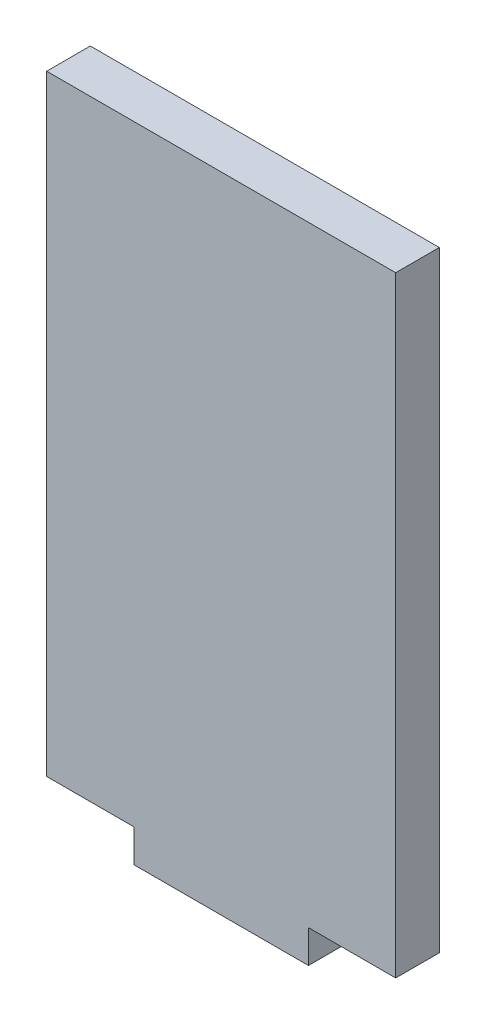
ISO-10303-21;
HEADER;
FILE_DESCRIPTION(('STEP AP214'),'2;1');
FILE_NAME('part.step','',(''),(''),'','','');
FILE_SCHEMA(('AUTOMOTIVE_DESIGN { 1 0 10303 214 1 1 1 1 }'));
ENDSEC;
DATA;
#1=APPLICATION_CONTEXT('core data for automotive mechanical design processes');
#2=APPLICATION_PROTOCOL_DEFINITION('international standard','automotive_design',2000,#1);
#3=PRODUCT_CONTEXT('',#1,'mechanical');
#4=PRODUCT('Part','Part','',(#3));
#5=PRODUCT_RELATED_PRODUCT_CATEGORY('part','',(#4));
#6=PRODUCT_DEFINITION_FORMATION('','',#4);
#7=PRODUCT_DEFINITION_CONTEXT('part definition',#1,'design');
#8=PRODUCT_DEFINITION('design','',#6,#7);
#9=PRODUCT_DEFINITION_SHAPE('','',#8);
#10=(LENGTH_UNIT() NAMED_UNIT(*) SI_UNIT(.MILLI.,.METRE.));
#11=(NAMED_UNIT(*) PLANE_ANGLE_UNIT() SI_UNIT($,.RADIAN.));
#12=(NAMED_UNIT(*) SI_UNIT($,.STERADIAN.) SOLID_ANGLE_UNIT());
#13=UNCERTAINTY_MEASURE_WITH_UNIT(LENGTH_MEASURE(1.E-05),#10,'distance_accuracy_value','');
#14=(GEOMETRIC_REPRESENTATION_CONTEXT(3) GLOBAL_UNCERTAINTY_ASSIGNED_CONTEXT((#13)) GLOBAL_UNIT_ASSIGNED_CONTEXT((#10,
#11,#12)) REPRESENTATION_CONTEXT('',''));
#15=CARTESIAN_POINT('',(0.,0.,0.));
#16=DIRECTION('',(0.,0.,1.));
#17=DIRECTION('',(1.,0.,0.));
#18=AXIS2_PLACEMENT_3D('',#15,#16,#17);
#19=CARTESIAN_POINT('',(0.,0.,3.175));
#20=DIRECTION('',(1.,0.,0.));
#21=DIRECTION('',(0.,1.,0.));
#22=AXIS2_PLACEMENT_3D('',#19,#20,#21);
#23=PLANE('',#22);
#24=DIRECTION('',(0.,-1.,0.));
#25=VECTOR('',#24,1.);
#26=CARTESIAN_POINT('',(0.,0.,0.));
#27=LINE('',#26,#25);
#28=CARTESIAN_POINT('',(0.,44.45,0.));
#29=VERTEX_POINT('',#28);
#30=CARTESIAN_POINT('',(0.,0.,0.));
#31=VERTEX_POINT('',#30);
#32=EDGE_CURVE('E129',#29,#31,#27,.T.);
#33=ORIENTED_EDGE('',*,*,#32,.T.);
#34=DIRECTION('',(0.,0.,-1.));
#35=VECTOR('',#34,1.);
#36=CARTESIAN_POINT('',(0.,0.,3.175));
#37=LINE('',#36,#35);
#38=CARTESIAN_POINT('',(0.,0.,3.175));
#39=VERTEX_POINT('',#38);
#40=EDGE_CURVE('E11',#39,#31,#37,.T.);
#41=ORIENTED_EDGE('',*,*,#40,.F.);
#42=DIRECTION('',(0.,-1.,0.));
#43=VECTOR('',#42,1.);
#44=CARTESIAN_POINT('',(0.,0.,3.175));
#45=LINE('',#44,#43);
#46=CARTESIAN_POINT('',(0.,44.45,3.175));
#47=VERTEX_POINT('',#46);
#48=EDGE_CURVE('E143',#47,#39,#45,.T.);
#49=ORIENTED_EDGE('',*,*,#48,.F.);
#50=DIRECTION('',(0.,0.,-1.));
#51=VECTOR('',#50,1.);
#52=CARTESIAN_POINT('',(0.,44.45,3.175));
#53=LINE('',#52,#51);
#54=EDGE_CURVE('E125',#47,#29,#53,.T.);
#55=ORIENTED_EDGE('',*,*,#54,.T.);
#56=EDGE_LOOP('',(#33,#41,#49,#55));
#57=FACE_BOUND('',#56,.T.);
#58=ADVANCED_FACE('F33',(#57),#23,.F.);
#59=CARTESIAN_POINT('',(0.,0.,3.175));
#60=DIRECTION('',(0.,1.,0.));
#61=DIRECTION('',(0.,0.,1.));
#62=AXIS2_PLACEMENT_3D('',#59,#60,#61);
#63=PLANE('',#62);
#64=DIRECTION('',(1.,0.,0.));
#65=VECTOR('',#64,1.);
#66=CARTESIAN_POINT('',(0.,0.,0.));
#67=LINE('',#66,#65);
#68=CARTESIAN_POINT('',(6.35,0.,0.));
#69=VERTEX_POINT('',#68);
#70=EDGE_CURVE('E132',#31,#69,#67,.T.);
#71=ORIENTED_EDGE('',*,*,#70,.T.);
#72=DIRECTION('',(0.,0.,-1.));
#73=VECTOR('',#72,1.);
#74=CARTESIAN_POINT('',(6.35,0.,3.175));
#75=LINE('',#74,#73);
#76=CARTESIAN_POINT('',(6.35,0.,3.175));
#77=VERTEX_POINT('',#76);
#78=EDGE_CURVE('E41',#77,#69,#75,.T.);
#79=ORIENTED_EDGE('',*,*,#78,.F.);
#80=DIRECTION('',(1.,0.,0.));
#81=VECTOR('',#80,1.);
#82=CARTESIAN_POINT('',(0.,0.,3.175));
#83=LINE('',#82,#81);
#84=EDGE_CURVE('E92',#39,#77,#83,.T.);
#85=ORIENTED_EDGE('',*,*,#84,.F.);
#86=ORIENTED_EDGE('',*,*,#40,.T.);
#87=EDGE_LOOP('',(#71,#79,#85,#86));
#88=FACE_BOUND('',#87,.T.);
#89=ADVANCED_FACE('F178',(#88),#63,.F.);
#90=CARTESIAN_POINT('',(6.35,0.,3.175));
#91=DIRECTION('',(1.,0.,0.));
#92=DIRECTION('',(0.,0.,-1.));
#93=AXIS2_PLACEMENT_3D('',#90,#91,#92);
#94=PLANE('',#93);
#95=DIRECTION('',(0.,-1.,0.));
#96=VECTOR('',#95,1.);
#97=CARTESIAN_POINT('',(6.35,0.,0.));
#98=LINE('',#97,#96);
#99=CARTESIAN_POINT('',(6.35,-2.38793491823931,0.));
#100=VERTEX_POINT('',#99);
#101=EDGE_CURVE('E134',#69,#100,#98,.T.);
#102=ORIENTED_EDGE('',*,*,#101,.T.);
#103=DIRECTION('',(0.,0.,-1.));
#104=VECTOR('',#103,1.);
#105=CARTESIAN_POINT('',(6.35,-2.38793491823931,3.175));
#106=LINE('',#105,#104);
#107=CARTESIAN_POINT('',(6.35,-2.38793491823931,3.175));
#108=VERTEX_POINT('',#107);
#109=EDGE_CURVE('E150',#108,#100,#106,.T.);
#110=ORIENTED_EDGE('',*,*,#109,.F.);
#111=DIRECTION('',(0.,-1.,0.));
#112=VECTOR('',#111,1.);
#113=CARTESIAN_POINT('',(6.35,0.,3.175));
#114=LINE('',#113,#112);
#115=EDGE_CURVE('E158',#77,#108,#114,.T.);
#116=ORIENTED_EDGE('',*,*,#115,.F.);
#117=ORIENTED_EDGE('',*,*,#78,.T.);
#118=EDGE_LOOP('',(#102,#110,#116,#117));
#119=FACE_BOUND('',#118,.T.);
#120=ADVANCED_FACE('F156',(#119),#94,.F.);
#121=CARTESIAN_POINT('',(6.35,-2.38793491823931,3.175));
#122=DIRECTION('',(0.,1.,0.));
#123=DIRECTION('',(0.,0.,1.));
#124=AXIS2_PLACEMENT_3D('',#121,#122,#123);
#125=PLANE('',#124);
#126=DIRECTION('',(1.,0.,0.));
#127=VECTOR('',#126,1.);
#128=CARTESIAN_POINT('',(6.35,-2.38793491823931,0.));
#129=LINE('',#128,#127);
#130=CARTESIAN_POINT('',(19.05,-2.38793491823931,0.));
#131=VERTEX_POINT('',#130);
#132=EDGE_CURVE('E136',#100,#131,#129,.T.);
#133=ORIENTED_EDGE('',*,*,#132,.T.);
#134=DIRECTION('',(0.,0.,-1.));
#135=VECTOR('',#134,1.);
#136=CARTESIAN_POINT('',(19.05,-2.38793491823931,3.175));
#137=LINE('',#136,#135);
#138=CARTESIAN_POINT('',(19.05,-2.38793491823931,3.175));
#139=VERTEX_POINT('',#138);
#140=EDGE_CURVE('E147',#139,#131,#137,.T.);
#141=ORIENTED_EDGE('',*,*,#140,.F.);
#142=DIRECTION('',(1.,0.,0.));
#143=VECTOR('',#142,1.);
#144=CARTESIAN_POINT('',(6.35,-2.38793491823931,3.175));
#145=LINE('',#144,#143);
#146=EDGE_CURVE('E170',#108,#139,#145,.T.);
#147=ORIENTED_EDGE('',*,*,#146,.F.);
#148=ORIENTED_EDGE('',*,*,#109,.T.);
#149=EDGE_LOOP('',(#133,#141,#147,#148));
#150=FACE_BOUND('',#149,.T.);
#151=ADVANCED_FACE('F166',(#150),#125,.F.);
#152=CARTESIAN_POINT('',(19.05,-2.38793491823931,3.175));
#153=DIRECTION('',(-1.,0.,0.));
#154=DIRECTION('',(0.,0.,1.));
#155=AXIS2_PLACEMENT_3D('',#152,#153,#154);
#156=PLANE('',#155);
#157=DIRECTION('',(0.,1.,0.));
#158=VECTOR('',#157,1.);
#159=CARTESIAN_POINT('',(19.05,-2.38793491823931,0.));
#160=LINE('',#159,#158);
#161=CARTESIAN_POINT('',(19.05,0.,0.));
#162=VERTEX_POINT('',#161);
#163=EDGE_CURVE('E138',#131,#162,#160,.T.);
#164=ORIENTED_EDGE('',*,*,#163,.T.);
#165=DIRECTION('',(0.,0.,-1.));
#166=VECTOR('',#165,1.);
#167=CARTESIAN_POINT('',(19.05,0.,3.175));
#168=LINE('',#167,#166);
#169=CARTESIAN_POINT('',(19.05,0.,3.175));
#170=VERTEX_POINT('',#169);
#171=EDGE_CURVE('E120',#170,#162,#168,.T.);
#172=ORIENTED_EDGE('',*,*,#171,.F.);
#173=DIRECTION('',(0.,1.,0.));
#174=VECTOR('',#173,1.);
#175=CARTESIAN_POINT('',(19.05,-2.38793491823931,3.175));
#176=LINE('',#175,#174);
#177=EDGE_CURVE('E111',#139,#170,#176,.T.);
#178=ORIENTED_EDGE('',*,*,#177,.F.);
#179=ORIENTED_EDGE('',*,*,#140,.T.);
#180=EDGE_LOOP('',(#164,#172,#178,#179));
#181=FACE_BOUND('',#180,.T.);
#182=ADVANCED_FACE('F169',(#181),#156,.F.);
#183=CARTESIAN_POINT('',(19.05,0.,3.175));
#184=DIRECTION('',(0.,1.,0.));
#185=DIRECTION('',(0.,0.,1.));
#186=AXIS2_PLACEMENT_3D('',#183,#184,#185);
#187=PLANE('',#186);
#188=DIRECTION('',(1.,0.,0.));
#189=VECTOR('',#188,1.);
#190=CARTESIAN_POINT('',(19.05,0.,0.));
#191=LINE('',#190,#189);
#192=CARTESIAN_POINT('',(25.4,0.,0.));
#193=VERTEX_POINT('',#192);
#194=EDGE_CURVE('E119',#162,#193,#191,.T.);
#195=ORIENTED_EDGE('',*,*,#194,.T.);
#196=DIRECTION('',(0.,0.,-1.));
#197=VECTOR('',#196,1.);
#198=CARTESIAN_POINT('',(25.4,0.,3.175));
#199=LINE('',#198,#197);
#200=CARTESIAN_POINT('',(25.4,0.,3.175));
#201=VERTEX_POINT('',#200);
#202=EDGE_CURVE('E116',#201,#193,#199,.T.);
#203=ORIENTED_EDGE('',*,*,#202,.F.);
#204=DIRECTION('',(1.,0.,0.));
#205=VECTOR('',#204,1.);
#206=CARTESIAN_POINT('',(19.05,0.,3.175));
#207=LINE('',#206,#205);
#208=EDGE_CURVE('E105',#170,#201,#207,.T.);
#209=ORIENTED_EDGE('',*,*,#208,.F.);
#210=ORIENTED_EDGE('',*,*,#171,.T.);
#211=EDGE_LOOP('',(#195,#203,#209,#210));
#212=FACE_BOUND('',#211,.T.);
#213=ADVANCED_FACE('F117',(#212),#187,.F.);
#214=CARTESIAN_POINT('',(25.4,0.,3.175));
#215=DIRECTION('',(-1.,0.,0.));
#216=DIRECTION('',(0.,-1.,0.));
#217=AXIS2_PLACEMENT_3D('',#214,#215,#216);
#218=PLANE('',#217);
#219=DIRECTION('',(0.,1.,0.));
#220=VECTOR('',#219,1.);
#221=CARTESIAN_POINT('',(25.4,0.,0.));
#222=LINE('',#221,#220);
#223=CARTESIAN_POINT('',(25.4,44.45,0.));
#224=VERTEX_POINT('',#223);
#225=EDGE_CURVE('E78',#193,#224,#222,.T.);
#226=ORIENTED_EDGE('',*,*,#225,.T.);
#227=DIRECTION('',(0.,0.,-1.));
#228=VECTOR('',#227,1.);
#229=CARTESIAN_POINT('',(25.4,44.45,3.175));
#230=LINE('',#229,#228);
#231=CARTESIAN_POINT('',(25.4,44.45,3.175));
#232=VERTEX_POINT('',#231);
#233=EDGE_CURVE('E121',#232,#224,#230,.T.);
#234=ORIENTED_EDGE('',*,*,#233,.F.);
#235=DIRECTION('',(0.,1.,0.));
#236=VECTOR('',#235,1.);
#237=CARTESIAN_POINT('',(25.4,0.,3.175));
#238=LINE('',#237,#236);
#239=EDGE_CURVE('E109',#201,#232,#238,.T.);
#240=ORIENTED_EDGE('',*,*,#239,.F.);
#241=ORIENTED_EDGE('',*,*,#202,.T.);
#242=EDGE_LOOP('',(#226,#234,#240,#241));
#243=FACE_BOUND('',#242,.T.);
#244=ADVANCED_FACE('F123',(#243),#218,.F.);
#245=CARTESIAN_POINT('',(0.,44.45,3.175));
#246=DIRECTION('',(0.,-1.,0.));
#247=DIRECTION('',(0.,0.,-1.));
#248=AXIS2_PLACEMENT_3D('',#245,#246,#247);
#249=PLANE('',#248);
#250=DIRECTION('',(-1.,0.,0.));
#251=VECTOR('',#250,1.);
#252=CARTESIAN_POINT('',(0.,44.45,0.));
#253=LINE('',#252,#251);
#254=EDGE_CURVE('E84',#224,#29,#253,.T.);
#255=ORIENTED_EDGE('',*,*,#254,.T.);
#256=ORIENTED_EDGE('',*,*,#54,.F.);
#257=DIRECTION('',(-1.,0.,0.));
#258=VECTOR('',#257,1.);
#259=CARTESIAN_POINT('',(0.,44.45,3.175));
#260=LINE('',#259,#258);
#261=EDGE_CURVE('E49',#232,#47,#260,.T.);
#262=ORIENTED_EDGE('',*,*,#261,.F.);
#263=ORIENTED_EDGE('',*,*,#233,.T.);
#264=EDGE_LOOP('',(#255,#256,#262,#263));
#265=FACE_BOUND('',#264,.T.);
#266=ADVANCED_FACE('F194',(#265),#249,.F.);
#267=CARTESIAN_POINT('',(0.,0.,3.175));
#268=DIRECTION('',(0.,0.,-1.));
#269=DIRECTION('',(-1.,0.,0.));
#270=AXIS2_PLACEMENT_3D('',#267,#268,#269);
#271=PLANE('',#270);
#272=ORIENTED_EDGE('',*,*,#48,.T.);
#273=ORIENTED_EDGE('',*,*,#84,.T.);
#274=ORIENTED_EDGE('',*,*,#115,.T.);
#275=ORIENTED_EDGE('',*,*,#146,.T.);
#276=ORIENTED_EDGE('',*,*,#177,.T.);
#277=ORIENTED_EDGE('',*,*,#208,.T.);
#278=ORIENTED_EDGE('',*,*,#239,.T.);
#279=ORIENTED_EDGE('',*,*,#261,.T.);
#280=EDGE_LOOP('',(#272,#273,#274,#275,#276,#277,#278,#279));
#281=FACE_BOUND('',#280,.T.);
#282=ADVANCED_FACE('F107',(#281),#271,.F.);
#283=CARTESIAN_POINT('',(0.,0.,0.));
#284=DIRECTION('',(0.,0.,-1.));
#285=DIRECTION('',(-1.,0.,0.));
#286=AXIS2_PLACEMENT_3D('',#283,#284,#285);
#287=PLANE('',#286);
#288=ORIENTED_EDGE('',*,*,#32,.F.);
#289=ORIENTED_EDGE('',*,*,#254,.F.);
#290=ORIENTED_EDGE('',*,*,#225,.F.);
#291=ORIENTED_EDGE('',*,*,#194,.F.);
#292=ORIENTED_EDGE('',*,*,#163,.F.);
#293=ORIENTED_EDGE('',*,*,#132,.F.);
#294=ORIENTED_EDGE('',*,*,#101,.F.);
#295=ORIENTED_EDGE('',*,*,#70,.F.);
#296=EDGE_LOOP('',(#288,#289,#290,#291,#292,#293,#294,#295));
#297=FACE_BOUND('',#296,.T.);
#298=ADVANCED_FACE('F162',(#297),#287,.T.);
#299=CLOSED_SHELL('',(#58,#89,#120,#151,#182,#213,#244,#266,#282,#298));
#300=MANIFOLD_SOLID_BREP('B2',#299);
#301=ADVANCED_BREP_SHAPE_REPRESENTATION('',(#18,#300),#14);
#302=SHAPE_DEFINITION_REPRESENTATION(#9,#301);
ENDSEC;
END-ISO-10303-21;
